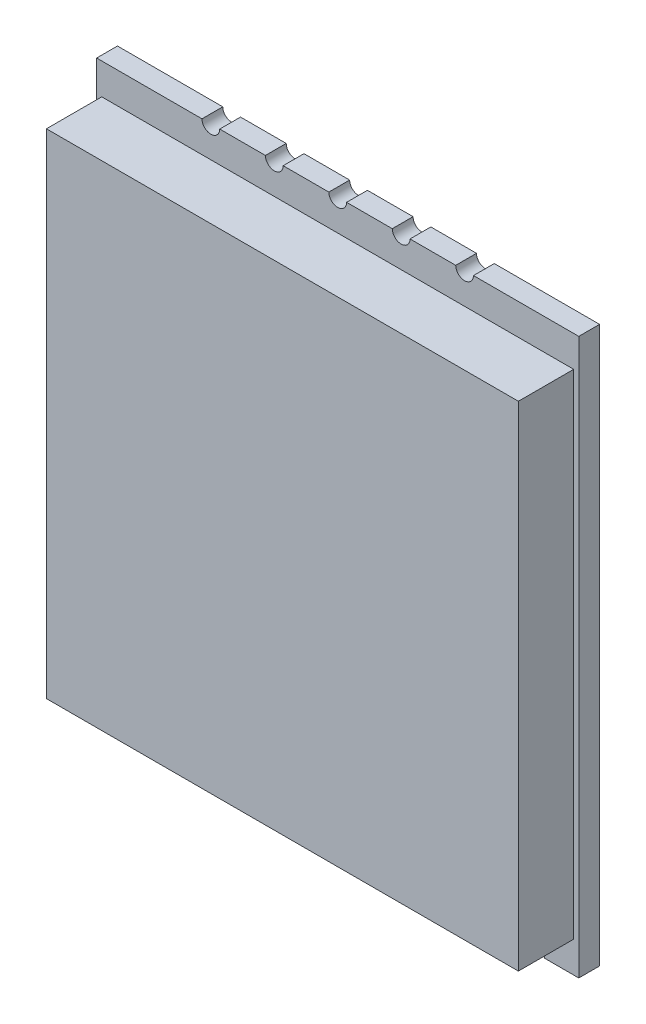
ISO-10303-21;
HEADER;
FILE_DESCRIPTION(('STEP AP214'),'2;1');
FILE_NAME('part.step','',(''),(''),'','','');
FILE_SCHEMA(('AUTOMOTIVE_DESIGN { 1 0 10303 214 1 1 1 1 }'));
ENDSEC;
DATA;
#1=APPLICATION_CONTEXT('core data for automotive mechanical design processes');
#2=APPLICATION_PROTOCOL_DEFINITION('international standard','automotive_design',2000,#1);
#3=PRODUCT_CONTEXT('',#1,'mechanical');
#4=PRODUCT('Part','Part','',(#3));
#5=PRODUCT_RELATED_PRODUCT_CATEGORY('part','',(#4));
#6=PRODUCT_DEFINITION_FORMATION('','',#4);
#7=PRODUCT_DEFINITION_CONTEXT('part definition',#1,'design');
#8=PRODUCT_DEFINITION('design','',#6,#7);
#9=PRODUCT_DEFINITION_SHAPE('','',#8);
#10=(LENGTH_UNIT() NAMED_UNIT(*) SI_UNIT(.MILLI.,.METRE.));
#11=(NAMED_UNIT(*) PLANE_ANGLE_UNIT() SI_UNIT($,.RADIAN.));
#12=(NAMED_UNIT(*) SI_UNIT($,.STERADIAN.) SOLID_ANGLE_UNIT());
#13=UNCERTAINTY_MEASURE_WITH_UNIT(LENGTH_MEASURE(1.E-05),#10,'distance_accuracy_value','');
#14=(GEOMETRIC_REPRESENTATION_CONTEXT(3) GLOBAL_UNCERTAINTY_ASSIGNED_CONTEXT((#13)) GLOBAL_UNIT_ASSIGNED_CONTEXT((#10,
#11,#12)) REPRESENTATION_CONTEXT('',''));
#15=CARTESIAN_POINT('',(0.,0.,0.));
#16=DIRECTION('',(0.,0.,1.));
#17=DIRECTION('',(1.,0.,0.));
#18=AXIS2_PLACEMENT_3D('',#15,#16,#17);
#19=CARTESIAN_POINT('',(0.,0.,0.82));
#20=DIRECTION('',(0.,1.,0.));
#21=DIRECTION('',(0.,0.,1.));
#22=AXIS2_PLACEMENT_3D('',#19,#20,#21);
#23=PLANE('',#22);
#24=DIRECTION('',(1.,0.,0.));
#25=VECTOR('',#24,1.);
#26=CARTESIAN_POINT('',(0.,0.,0.));
#27=LINE('',#26,#25);
#28=CARTESIAN_POINT('',(15.05,0.,0.));
#29=VERTEX_POINT('',#28);
#30=CARTESIAN_POINT('',(16.95,0.,0.));
#31=VERTEX_POINT('',#30);
#32=EDGE_CURVE('E260',#29,#31,#27,.T.);
#33=ORIENTED_EDGE('',*,*,#32,.T.);
#34=DIRECTION('',(0.,0.,1.));
#35=VECTOR('',#34,1.);
#36=CARTESIAN_POINT('',(16.95,0.,0.));
#37=LINE('',#36,#35);
#38=CARTESIAN_POINT('',(16.95,0.,0.82));
#39=VERTEX_POINT('',#38);
#40=EDGE_CURVE('E55',#31,#39,#37,.T.);
#41=ORIENTED_EDGE('',*,*,#40,.T.);
#42=DIRECTION('',(1.,0.,0.));
#43=VECTOR('',#42,1.);
#44=CARTESIAN_POINT('',(0.,0.,0.82));
#45=LINE('',#44,#43);
#46=CARTESIAN_POINT('',(15.05,0.,0.82));
#47=VERTEX_POINT('',#46);
#48=EDGE_CURVE('E508',#47,#39,#45,.T.);
#49=ORIENTED_EDGE('',*,*,#48,.F.);
#50=DIRECTION('',(0.,0.,1.));
#51=VECTOR('',#50,1.);
#52=CARTESIAN_POINT('',(15.05,0.,0.));
#53=LINE('',#52,#51);
#54=EDGE_CURVE('E304',#47,#29,#53,.F.);
#55=ORIENTED_EDGE('',*,*,#54,.T.);
#56=EDGE_LOOP('',(#33,#41,#49,#55));
#57=FACE_BOUND('',#56,.T.);
#58=ADVANCED_FACE('F39',(#57),#23,.F.);
#59=CARTESIAN_POINT('',(12.45,0.,0.));
#60=VERTEX_POINT('',#59);
#61=CARTESIAN_POINT('',(14.35,0.,0.));
#62=VERTEX_POINT('',#61);
#63=EDGE_CURVE('E264',#60,#62,#27,.T.);
#64=ORIENTED_EDGE('',*,*,#63,.T.);
#65=DIRECTION('',(0.,0.,1.));
#66=VECTOR('',#65,1.);
#67=CARTESIAN_POINT('',(14.35,0.,0.));
#68=LINE('',#67,#66);
#69=CARTESIAN_POINT('',(14.35,0.,0.82));
#70=VERTEX_POINT('',#69);
#71=EDGE_CURVE('E63',#62,#70,#68,.T.);
#72=ORIENTED_EDGE('',*,*,#71,.T.);
#73=CARTESIAN_POINT('',(12.45,0.,0.82));
#74=VERTEX_POINT('',#73);
#75=EDGE_CURVE('E509',#74,#70,#45,.T.);
#76=ORIENTED_EDGE('',*,*,#75,.F.);
#77=DIRECTION('',(0.,0.,1.));
#78=VECTOR('',#77,1.);
#79=CARTESIAN_POINT('',(12.45,0.,0.));
#80=LINE('',#79,#78);
#81=EDGE_CURVE('E299',#74,#60,#80,.F.);
#82=ORIENTED_EDGE('',*,*,#81,.T.);
#83=EDGE_LOOP('',(#64,#72,#76,#82));
#84=FACE_BOUND('',#83,.T.);
#85=ADVANCED_FACE('F296',(#84),#23,.F.);
#86=CARTESIAN_POINT('',(9.85,0.,0.));
#87=VERTEX_POINT('',#86);
#88=CARTESIAN_POINT('',(11.75,0.,0.));
#89=VERTEX_POINT('',#88);
#90=EDGE_CURVE('E282',#87,#89,#27,.T.);
#91=ORIENTED_EDGE('',*,*,#90,.T.);
#92=DIRECTION('',(0.,0.,1.));
#93=VECTOR('',#92,1.);
#94=CARTESIAN_POINT('',(11.75,0.,0.));
#95=LINE('',#94,#93);
#96=CARTESIAN_POINT('',(11.75,0.,0.82));
#97=VERTEX_POINT('',#96);
#98=EDGE_CURVE('E316',#89,#97,#95,.T.);
#99=ORIENTED_EDGE('',*,*,#98,.T.);
#100=CARTESIAN_POINT('',(9.85,0.,0.82));
#101=VERTEX_POINT('',#100);
#102=EDGE_CURVE('E512',#101,#97,#45,.T.);
#103=ORIENTED_EDGE('',*,*,#102,.F.);
#104=DIRECTION('',(0.,0.,1.));
#105=VECTOR('',#104,1.);
#106=CARTESIAN_POINT('',(9.85,0.,0.));
#107=LINE('',#106,#105);
#108=EDGE_CURVE('E322',#101,#87,#107,.F.);
#109=ORIENTED_EDGE('',*,*,#108,.T.);
#110=EDGE_LOOP('',(#91,#99,#103,#109));
#111=FACE_BOUND('',#110,.T.);
#112=ADVANCED_FACE('F529',(#111),#23,.F.);
#113=CARTESIAN_POINT('',(7.25,0.,0.));
#114=VERTEX_POINT('',#113);
#115=CARTESIAN_POINT('',(9.15,0.,0.));
#116=VERTEX_POINT('',#115);
#117=EDGE_CURVE('E276',#114,#116,#27,.T.);
#118=ORIENTED_EDGE('',*,*,#117,.T.);
#119=DIRECTION('',(0.,0.,1.));
#120=VECTOR('',#119,1.);
#121=CARTESIAN_POINT('',(9.15,0.,0.));
#122=LINE('',#121,#120);
#123=CARTESIAN_POINT('',(9.15,0.,0.82));
#124=VERTEX_POINT('',#123);
#125=EDGE_CURVE('E325',#116,#124,#122,.T.);
#126=ORIENTED_EDGE('',*,*,#125,.T.);
#127=CARTESIAN_POINT('',(7.25,0.,0.82));
#128=VERTEX_POINT('',#127);
#129=EDGE_CURVE('E515',#128,#124,#45,.T.);
#130=ORIENTED_EDGE('',*,*,#129,.F.);
#131=DIRECTION('',(0.,0.,1.));
#132=VECTOR('',#131,1.);
#133=CARTESIAN_POINT('',(7.25,0.,0.));
#134=LINE('',#133,#132);
#135=EDGE_CURVE('E331',#128,#114,#134,.F.);
#136=ORIENTED_EDGE('',*,*,#135,.T.);
#137=EDGE_LOOP('',(#118,#126,#130,#136));
#138=FACE_BOUND('',#137,.T.);
#139=ADVANCED_FACE('F561',(#138),#23,.F.);
#140=CARTESIAN_POINT('',(4.65,0.,0.));
#141=VERTEX_POINT('',#140);
#142=CARTESIAN_POINT('',(6.55,0.,0.));
#143=VERTEX_POINT('',#142);
#144=EDGE_CURVE('E270',#141,#143,#27,.T.);
#145=ORIENTED_EDGE('',*,*,#144,.T.);
#146=DIRECTION('',(0.,0.,1.));
#147=VECTOR('',#146,1.);
#148=CARTESIAN_POINT('',(6.55,0.,0.));
#149=LINE('',#148,#147);
#150=CARTESIAN_POINT('',(6.55,0.,0.82));
#151=VERTEX_POINT('',#150);
#152=EDGE_CURVE('E334',#143,#151,#149,.T.);
#153=ORIENTED_EDGE('',*,*,#152,.T.);
#154=CARTESIAN_POINT('',(4.65,0.,0.82));
#155=VERTEX_POINT('',#154);
#156=EDGE_CURVE('E434',#155,#151,#45,.T.);
#157=ORIENTED_EDGE('',*,*,#156,.F.);
#158=DIRECTION('',(0.,0.,1.));
#159=VECTOR('',#158,1.);
#160=CARTESIAN_POINT('',(4.65,0.,0.));
#161=LINE('',#160,#159);
#162=EDGE_CURVE('E340',#155,#141,#161,.F.);
#163=ORIENTED_EDGE('',*,*,#162,.T.);
#164=EDGE_LOOP('',(#145,#153,#157,#163));
#165=FACE_BOUND('',#164,.T.);
#166=ADVANCED_FACE('F524',(#165),#23,.F.);
#167=CARTESIAN_POINT('',(0.,0.,0.));
#168=VERTEX_POINT('',#167);
#169=CARTESIAN_POINT('',(3.95,0.,0.));
#170=VERTEX_POINT('',#169);
#171=EDGE_CURVE('E263',#168,#170,#27,.T.);
#172=ORIENTED_EDGE('',*,*,#171,.T.);
#173=DIRECTION('',(0.,0.,1.));
#174=VECTOR('',#173,1.);
#175=CARTESIAN_POINT('',(3.95,0.,0.));
#176=LINE('',#175,#174);
#177=CARTESIAN_POINT('',(3.95,0.,0.82));
#178=VERTEX_POINT('',#177);
#179=EDGE_CURVE('E343',#170,#178,#176,.T.);
#180=ORIENTED_EDGE('',*,*,#179,.T.);
#181=CARTESIAN_POINT('',(0.,0.,0.82));
#182=VERTEX_POINT('',#181);
#183=EDGE_CURVE('E430',#182,#178,#45,.T.);
#184=ORIENTED_EDGE('',*,*,#183,.F.);
#185=DIRECTION('',(0.,0.,-1.));
#186=VECTOR('',#185,1.);
#187=CARTESIAN_POINT('',(0.,0.,0.82));
#188=LINE('',#187,#186);
#189=EDGE_CURVE('E485',#182,#168,#188,.T.);
#190=ORIENTED_EDGE('',*,*,#189,.T.);
#191=EDGE_LOOP('',(#172,#180,#184,#190));
#192=FACE_BOUND('',#191,.T.);
#193=ADVANCED_FACE('F548',(#192),#23,.F.);
#194=CARTESIAN_POINT('',(0.,21.9,0.82));
#195=DIRECTION('',(0.,-1.,0.));
#196=DIRECTION('',(0.,0.,-1.));
#197=AXIS2_PLACEMENT_3D('',#194,#195,#196);
#198=PLANE('',#197);
#199=DIRECTION('',(-1.,0.,0.));
#200=VECTOR('',#199,1.);
#201=CARTESIAN_POINT('',(0.,21.9,0.));
#202=LINE('',#201,#200);
#203=CARTESIAN_POINT('',(19.,21.9,0.));
#204=VERTEX_POINT('',#203);
#205=CARTESIAN_POINT('',(14.85,21.9,0.));
#206=VERTEX_POINT('',#205);
#207=EDGE_CURVE('E429',#204,#206,#202,.T.);
#208=ORIENTED_EDGE('',*,*,#207,.T.);
#209=DIRECTION('',(0.,0.,1.));
#210=VECTOR('',#209,1.);
#211=CARTESIAN_POINT('',(14.85,21.9,0.));
#212=LINE('',#211,#210);
#213=CARTESIAN_POINT('',(14.85,21.9,0.82));
#214=VERTEX_POINT('',#213);
#215=EDGE_CURVE('E352',#206,#214,#212,.T.);
#216=ORIENTED_EDGE('',*,*,#215,.T.);
#217=DIRECTION('',(-1.,0.,0.));
#218=VECTOR('',#217,1.);
#219=CARTESIAN_POINT('',(0.,21.9,0.82));
#220=LINE('',#219,#218);
#221=CARTESIAN_POINT('',(19.,21.9,0.82));
#222=VERTEX_POINT('',#221);
#223=EDGE_CURVE('E437',#222,#214,#220,.T.);
#224=ORIENTED_EDGE('',*,*,#223,.F.);
#225=DIRECTION('',(0.,0.,-1.));
#226=VECTOR('',#225,1.);
#227=CARTESIAN_POINT('',(19.,21.9,0.82));
#228=LINE('',#227,#226);
#229=EDGE_CURVE('E446',#222,#204,#228,.T.);
#230=ORIENTED_EDGE('',*,*,#229,.T.);
#231=EDGE_LOOP('',(#208,#216,#224,#230));
#232=FACE_BOUND('',#231,.T.);
#233=ADVANCED_FACE('F503',(#232),#198,.F.);
#234=CARTESIAN_POINT('',(14.15,21.9,0.82));
#235=VERTEX_POINT('',#234);
#236=CARTESIAN_POINT('',(12.35,21.9,0.82));
#237=VERTEX_POINT('',#236);
#238=EDGE_CURVE('E441',#235,#237,#220,.T.);
#239=ORIENTED_EDGE('',*,*,#238,.F.);
#240=DIRECTION('',(0.,0.,1.));
#241=VECTOR('',#240,1.);
#242=CARTESIAN_POINT('',(14.15,21.9,0.));
#243=LINE('',#242,#241);
#244=CARTESIAN_POINT('',(14.15,21.9,0.));
#245=VERTEX_POINT('',#244);
#246=EDGE_CURVE('E348',#235,#245,#243,.F.);
#247=ORIENTED_EDGE('',*,*,#246,.T.);
#248=CARTESIAN_POINT('',(12.35,21.9,0.));
#249=VERTEX_POINT('',#248);
#250=EDGE_CURVE('E473',#245,#249,#202,.T.);
#251=ORIENTED_EDGE('',*,*,#250,.T.);
#252=DIRECTION('',(0.,0.,1.));
#253=VECTOR('',#252,1.);
#254=CARTESIAN_POINT('',(12.35,21.9,0.));
#255=LINE('',#254,#253);
#256=EDGE_CURVE('E362',#249,#237,#255,.T.);
#257=ORIENTED_EDGE('',*,*,#256,.T.);
#258=EDGE_LOOP('',(#239,#247,#251,#257));
#259=FACE_BOUND('',#258,.T.);
#260=ADVANCED_FACE('F499',(#259),#198,.F.);
#261=CARTESIAN_POINT('',(11.65,21.9,0.82));
#262=VERTEX_POINT('',#261);
#263=CARTESIAN_POINT('',(9.85,21.9,0.82));
#264=VERTEX_POINT('',#263);
#265=EDGE_CURVE('E449',#262,#264,#220,.T.);
#266=ORIENTED_EDGE('',*,*,#265,.F.);
#267=DIRECTION('',(0.,0.,1.));
#268=VECTOR('',#267,1.);
#269=CARTESIAN_POINT('',(11.65,21.9,0.));
#270=LINE('',#269,#268);
#271=CARTESIAN_POINT('',(11.65,21.9,0.));
#272=VERTEX_POINT('',#271);
#273=EDGE_CURVE('E359',#262,#272,#270,.F.);
#274=ORIENTED_EDGE('',*,*,#273,.T.);
#275=CARTESIAN_POINT('',(9.85,21.9,0.));
#276=VERTEX_POINT('',#275);
#277=EDGE_CURVE('E471',#272,#276,#202,.T.);
#278=ORIENTED_EDGE('',*,*,#277,.T.);
#279=DIRECTION('',(0.,0.,1.));
#280=VECTOR('',#279,1.);
#281=CARTESIAN_POINT('',(9.85,21.9,0.));
#282=LINE('',#281,#280);
#283=EDGE_CURVE('E371',#276,#264,#282,.T.);
#284=ORIENTED_EDGE('',*,*,#283,.T.);
#285=EDGE_LOOP('',(#266,#274,#278,#284));
#286=FACE_BOUND('',#285,.T.);
#287=ADVANCED_FACE('F469',(#286),#198,.F.);
#288=CARTESIAN_POINT('',(9.15,21.9,0.82));
#289=VERTEX_POINT('',#288);
#290=CARTESIAN_POINT('',(7.35,21.9,0.82));
#291=VERTEX_POINT('',#290);
#292=EDGE_CURVE('E454',#289,#291,#220,.T.);
#293=ORIENTED_EDGE('',*,*,#292,.F.);
#294=DIRECTION('',(0.,0.,1.));
#295=VECTOR('',#294,1.);
#296=CARTESIAN_POINT('',(9.15,21.9,0.));
#297=LINE('',#296,#295);
#298=CARTESIAN_POINT('',(9.15,21.9,0.));
#299=VERTEX_POINT('',#298);
#300=EDGE_CURVE('E368',#289,#299,#297,.F.);
#301=ORIENTED_EDGE('',*,*,#300,.T.);
#302=CARTESIAN_POINT('',(7.35,21.9,0.));
#303=VERTEX_POINT('',#302);
#304=EDGE_CURVE('E474',#299,#303,#202,.T.);
#305=ORIENTED_EDGE('',*,*,#304,.T.);
#306=DIRECTION('',(0.,0.,1.));
#307=VECTOR('',#306,1.);
#308=CARTESIAN_POINT('',(7.35,21.9,0.));
#309=LINE('',#308,#307);
#310=EDGE_CURVE('E380',#303,#291,#309,.T.);
#311=ORIENTED_EDGE('',*,*,#310,.T.);
#312=EDGE_LOOP('',(#293,#301,#305,#311));
#313=FACE_BOUND('',#312,.T.);
#314=ADVANCED_FACE('F663',(#313),#198,.F.);
#315=CARTESIAN_POINT('',(6.65,21.9,0.82));
#316=VERTEX_POINT('',#315);
#317=CARTESIAN_POINT('',(4.85,21.9,0.82));
#318=VERTEX_POINT('',#317);
#319=EDGE_CURVE('E450',#316,#318,#220,.T.);
#320=ORIENTED_EDGE('',*,*,#319,.F.);
#321=DIRECTION('',(0.,0.,1.));
#322=VECTOR('',#321,1.);
#323=CARTESIAN_POINT('',(6.65,21.9,0.));
#324=LINE('',#323,#322);
#325=CARTESIAN_POINT('',(6.65,21.9,0.));
#326=VERTEX_POINT('',#325);
#327=EDGE_CURVE('E377',#316,#326,#324,.F.);
#328=ORIENTED_EDGE('',*,*,#327,.T.);
#329=CARTESIAN_POINT('',(4.85,21.9,0.));
#330=VERTEX_POINT('',#329);
#331=EDGE_CURVE('E477',#326,#330,#202,.T.);
#332=ORIENTED_EDGE('',*,*,#331,.T.);
#333=DIRECTION('',(0.,0.,1.));
#334=VECTOR('',#333,1.);
#335=CARTESIAN_POINT('',(4.85,21.9,0.));
#336=LINE('',#335,#334);
#337=EDGE_CURVE('E389',#330,#318,#336,.T.);
#338=ORIENTED_EDGE('',*,*,#337,.T.);
#339=EDGE_LOOP('',(#320,#328,#332,#338));
#340=FACE_BOUND('',#339,.T.);
#341=ADVANCED_FACE('F657',(#340),#198,.F.);
#342=CARTESIAN_POINT('',(0.,0.,0.82));
#343=DIRECTION('',(0.,0.,-1.));
#344=DIRECTION('',(-1.,0.,0.));
#345=AXIS2_PLACEMENT_3D('',#342,#343,#344);
#346=PLANE('',#345);
#347=ORIENTED_EDGE('',*,*,#48,.T.);
#348=CARTESIAN_POINT('',(17.3,0.,0.82));
#349=DIRECTION('',(0.,0.,1.));
#350=DIRECTION('',(1.,0.,0.));
#351=AXIS2_PLACEMENT_3D('',#348,#349,#350);
#352=CIRCLE('',#351,0.350000000000001);
#353=CARTESIAN_POINT('',(17.65,0.,0.82));
#354=VERTEX_POINT('',#353);
#355=EDGE_CURVE('E246',#354,#39,#352,.T.);
#356=ORIENTED_EDGE('',*,*,#355,.F.);
#357=CARTESIAN_POINT('',(19.,0.,0.82));
#358=VERTEX_POINT('',#357);
#359=EDGE_CURVE('E254',#354,#358,#45,.T.);
#360=ORIENTED_EDGE('',*,*,#359,.T.);
#361=DIRECTION('',(0.,1.,0.));
#362=VECTOR('',#361,1.);
#363=CARTESIAN_POINT('',(19.,0.,0.82));
#364=LINE('',#363,#362);
#365=EDGE_CURVE('E433',#358,#222,#364,.T.);
#366=ORIENTED_EDGE('',*,*,#365,.T.);
#367=ORIENTED_EDGE('',*,*,#223,.T.);
#368=CARTESIAN_POINT('',(14.5,21.9,0.82));
#369=DIRECTION('',(0.,0.,1.));
#370=DIRECTION('',(1.,0.,0.));
#371=AXIS2_PLACEMENT_3D('',#368,#369,#370);
#372=CIRCLE('',#371,0.349999999999999);
#373=EDGE_CURVE('E345',#235,#214,#372,.T.);
#374=ORIENTED_EDGE('',*,*,#373,.F.);
#375=ORIENTED_EDGE('',*,*,#238,.T.);
#376=CARTESIAN_POINT('',(12.,21.9,0.82));
#377=DIRECTION('',(0.,0.,1.));
#378=DIRECTION('',(1.,0.,0.));
#379=AXIS2_PLACEMENT_3D('',#376,#377,#378);
#380=CIRCLE('',#379,0.349999999999999);
#381=EDGE_CURVE('E356',#262,#237,#380,.T.);
#382=ORIENTED_EDGE('',*,*,#381,.F.);
#383=ORIENTED_EDGE('',*,*,#265,.T.);
#384=CARTESIAN_POINT('',(9.5,21.9,0.82));
#385=DIRECTION('',(0.,0.,1.));
#386=DIRECTION('',(1.,0.,0.));
#387=AXIS2_PLACEMENT_3D('',#384,#385,#386);
#388=CIRCLE('',#387,0.349999999999999);
#389=EDGE_CURVE('E365',#289,#264,#388,.T.);
#390=ORIENTED_EDGE('',*,*,#389,.F.);
#391=ORIENTED_EDGE('',*,*,#292,.T.);
#392=CARTESIAN_POINT('',(7.,21.9,0.82));
#393=DIRECTION('',(0.,0.,1.));
#394=DIRECTION('',(1.,0.,0.));
#395=AXIS2_PLACEMENT_3D('',#392,#393,#394);
#396=CIRCLE('',#395,0.349999999999999);
#397=EDGE_CURVE('E374',#316,#291,#396,.T.);
#398=ORIENTED_EDGE('',*,*,#397,.F.);
#399=ORIENTED_EDGE('',*,*,#319,.T.);
#400=CARTESIAN_POINT('',(4.5,21.9,0.82));
#401=DIRECTION('',(0.,0.,1.));
#402=DIRECTION('',(1.,0.,0.));
#403=AXIS2_PLACEMENT_3D('',#400,#401,#402);
#404=CIRCLE('',#403,0.35);
#405=CARTESIAN_POINT('',(4.15,21.9,0.82));
#406=VERTEX_POINT('',#405);
#407=EDGE_CURVE('E383',#406,#318,#404,.T.);
#408=ORIENTED_EDGE('',*,*,#407,.F.);
#409=CARTESIAN_POINT('',(0.,21.9,0.82));
#410=VERTEX_POINT('',#409);
#411=EDGE_CURVE('E436',#406,#410,#220,.T.);
#412=ORIENTED_EDGE('',*,*,#411,.T.);
#413=DIRECTION('',(0.,-1.,0.));
#414=VECTOR('',#413,1.);
#415=CARTESIAN_POINT('',(0.,0.,0.82));
#416=LINE('',#415,#414);
#417=EDGE_CURVE('E426',#410,#182,#416,.T.);
#418=ORIENTED_EDGE('',*,*,#417,.T.);
#419=ORIENTED_EDGE('',*,*,#183,.T.);
#420=CARTESIAN_POINT('',(4.3,0.,0.82));
#421=DIRECTION('',(0.,0.,1.));
#422=DIRECTION('',(1.,0.,0.));
#423=AXIS2_PLACEMENT_3D('',#420,#421,#422);
#424=CIRCLE('',#423,0.349999999999999);
#425=EDGE_CURVE('E336',#155,#178,#424,.T.);
#426=ORIENTED_EDGE('',*,*,#425,.F.);
#427=ORIENTED_EDGE('',*,*,#156,.T.);
#428=CARTESIAN_POINT('',(6.9,0.,0.82));
#429=DIRECTION('',(0.,0.,1.));
#430=DIRECTION('',(1.,0.,0.));
#431=AXIS2_PLACEMENT_3D('',#428,#429,#430);
#432=CIRCLE('',#431,0.349999999999999);
#433=EDGE_CURVE('E327',#128,#151,#432,.T.);
#434=ORIENTED_EDGE('',*,*,#433,.F.);
#435=ORIENTED_EDGE('',*,*,#129,.T.);
#436=CARTESIAN_POINT('',(9.5,0.,0.82));
#437=DIRECTION('',(0.,0.,1.));
#438=DIRECTION('',(1.,0.,0.));
#439=AXIS2_PLACEMENT_3D('',#436,#437,#438);
#440=CIRCLE('',#439,0.349999999999999);
#441=EDGE_CURVE('E318',#101,#124,#440,.T.);
#442=ORIENTED_EDGE('',*,*,#441,.F.);
#443=ORIENTED_EDGE('',*,*,#102,.T.);
#444=CARTESIAN_POINT('',(12.1,0.,0.82));
#445=DIRECTION('',(0.,0.,1.));
#446=DIRECTION('',(1.,0.,0.));
#447=AXIS2_PLACEMENT_3D('',#444,#445,#446);
#448=CIRCLE('',#447,0.349999999999999);
#449=EDGE_CURVE('E312',#74,#97,#448,.T.);
#450=ORIENTED_EDGE('',*,*,#449,.F.);
#451=ORIENTED_EDGE('',*,*,#75,.T.);
#452=CARTESIAN_POINT('',(14.7,0.,0.82));
#453=DIRECTION('',(0.,0.,1.));
#454=DIRECTION('',(1.,0.,0.));
#455=AXIS2_PLACEMENT_3D('',#452,#453,#454);
#456=CIRCLE('',#455,0.350000000000001);
#457=EDGE_CURVE('E305',#47,#70,#456,.T.);
#458=ORIENTED_EDGE('',*,*,#457,.F.);
#459=EDGE_LOOP('',(#347,#356,#360,#366,#367,#374,#375,#382,#383,#390,#391,#398,#399,#408,#412,
#418,#419,#426,#427,#434,#435,#442,#443,#450,#451,#458));
#460=FACE_BOUND('',#459,.T.);
#461=DIRECTION('',(0.,-1.,0.));
#462=VECTOR('',#461,1.);
#463=CARTESIAN_POINT('',(0.199999999999999,1.225,0.82));
#464=LINE('',#463,#462);
#465=CARTESIAN_POINT('',(0.199999999999999,20.675,0.82));
#466=VERTEX_POINT('',#465);
#467=CARTESIAN_POINT('',(0.199999999999999,1.225,0.82));
#468=VERTEX_POINT('',#467);
#469=EDGE_CURVE('E392',#466,#468,#464,.T.);
#470=ORIENTED_EDGE('',*,*,#469,.F.);
#471=DIRECTION('',(-1.,0.,0.));
#472=VECTOR('',#471,1.);
#473=CARTESIAN_POINT('',(0.199999999999999,20.675,0.82));
#474=LINE('',#473,#472);
#475=CARTESIAN_POINT('',(18.8,20.675,0.82));
#476=VERTEX_POINT('',#475);
#477=EDGE_CURVE('E397',#476,#466,#474,.T.);
#478=ORIENTED_EDGE('',*,*,#477,.F.);
#479=DIRECTION('',(0.,1.,0.));
#480=VECTOR('',#479,1.);
#481=CARTESIAN_POINT('',(18.8,1.225,0.82));
#482=LINE('',#481,#480);
#483=CARTESIAN_POINT('',(18.8,1.225,0.82));
#484=VERTEX_POINT('',#483);
#485=EDGE_CURVE('E410',#484,#476,#482,.T.);
#486=ORIENTED_EDGE('',*,*,#485,.F.);
#487=DIRECTION('',(1.,0.,0.));
#488=VECTOR('',#487,1.);
#489=CARTESIAN_POINT('',(0.199999999999999,1.225,0.82));
#490=LINE('',#489,#488);
#491=EDGE_CURVE('E407',#468,#484,#490,.T.);
#492=ORIENTED_EDGE('',*,*,#491,.F.);
#493=EDGE_LOOP('',(#470,#478,#486,#492));
#494=FACE_BOUND('',#493,.T.);
#495=ADVANCED_FACE('F462',(#460,#494),#346,.F.);
#496=CARTESIAN_POINT('',(0.,0.,0.82));
#497=DIRECTION('',(1.,0.,0.));
#498=DIRECTION('',(0.,0.,-1.));
#499=AXIS2_PLACEMENT_3D('',#496,#497,#498);
#500=PLANE('',#499);
#501=DIRECTION('',(0.,-1.,0.));
#502=VECTOR('',#501,1.);
#503=CARTESIAN_POINT('',(0.,0.,0.));
#504=LINE('',#503,#502);
#505=CARTESIAN_POINT('',(0.,21.9,0.));
#506=VERTEX_POINT('',#505);
#507=EDGE_CURVE('E261',#506,#168,#504,.T.);
#508=ORIENTED_EDGE('',*,*,#507,.T.);
#509=ORIENTED_EDGE('',*,*,#189,.F.);
#510=ORIENTED_EDGE('',*,*,#417,.F.);
#511=DIRECTION('',(0.,0.,-1.));
#512=VECTOR('',#511,1.);
#513=CARTESIAN_POINT('',(0.,21.9,0.82));
#514=LINE('',#513,#512);
#515=EDGE_CURVE('E440',#410,#506,#514,.T.);
#516=ORIENTED_EDGE('',*,*,#515,.T.);
#517=EDGE_LOOP('',(#508,#509,#510,#516));
#518=FACE_BOUND('',#517,.T.);
#519=ADVANCED_FACE('F41',(#518),#500,.F.);
#520=ORIENTED_EDGE('',*,*,#359,.F.);
#521=DIRECTION('',(0.,0.,1.));
#522=VECTOR('',#521,1.);
#523=CARTESIAN_POINT('',(17.65,0.,0.));
#524=LINE('',#523,#522);
#525=CARTESIAN_POINT('',(17.65,0.,0.));
#526=VERTEX_POINT('',#525);
#527=EDGE_CURVE('E240',#354,#526,#524,.F.);
#528=ORIENTED_EDGE('',*,*,#527,.T.);
#529=CARTESIAN_POINT('',(19.,0.,0.));
#530=VERTEX_POINT('',#529);
#531=EDGE_CURVE('E252',#526,#530,#27,.T.);
#532=ORIENTED_EDGE('',*,*,#531,.T.);
#533=DIRECTION('',(0.,0.,-1.));
#534=VECTOR('',#533,1.);
#535=CARTESIAN_POINT('',(19.,0.,0.82));
#536=LINE('',#535,#534);
#537=EDGE_CURVE('E483',#358,#530,#536,.T.);
#538=ORIENTED_EDGE('',*,*,#537,.F.);
#539=EDGE_LOOP('',(#520,#528,#532,#538));
#540=FACE_BOUND('',#539,.T.);
#541=ADVANCED_FACE('F250',(#540),#23,.F.);
#542=CARTESIAN_POINT('',(19.,0.,0.82));
#543=DIRECTION('',(-1.,0.,0.));
#544=DIRECTION('',(0.,0.,1.));
#545=AXIS2_PLACEMENT_3D('',#542,#543,#544);
#546=PLANE('',#545);
#547=DIRECTION('',(0.,1.,0.));
#548=VECTOR('',#547,1.);
#549=CARTESIAN_POINT('',(19.,0.,0.));
#550=LINE('',#549,#548);
#551=EDGE_CURVE('E259',#530,#204,#550,.T.);
#552=ORIENTED_EDGE('',*,*,#551,.T.);
#553=ORIENTED_EDGE('',*,*,#229,.F.);
#554=ORIENTED_EDGE('',*,*,#365,.F.);
#555=ORIENTED_EDGE('',*,*,#537,.T.);
#556=EDGE_LOOP('',(#552,#553,#554,#555));
#557=FACE_BOUND('',#556,.T.);
#558=ADVANCED_FACE('F507',(#557),#546,.F.);
#559=ORIENTED_EDGE('',*,*,#411,.F.);
#560=DIRECTION('',(0.,0.,1.));
#561=VECTOR('',#560,1.);
#562=CARTESIAN_POINT('',(4.15,21.9,0.));
#563=LINE('',#562,#561);
#564=CARTESIAN_POINT('',(4.15,21.9,0.));
#565=VERTEX_POINT('',#564);
#566=EDGE_CURVE('E386',#406,#565,#563,.F.);
#567=ORIENTED_EDGE('',*,*,#566,.T.);
#568=EDGE_CURVE('E274',#565,#506,#202,.T.);
#569=ORIENTED_EDGE('',*,*,#568,.T.);
#570=ORIENTED_EDGE('',*,*,#515,.F.);
#571=EDGE_LOOP('',(#559,#567,#569,#570));
#572=FACE_BOUND('',#571,.T.);
#573=ADVANCED_FACE('F553',(#572),#198,.F.);
#574=CARTESIAN_POINT('',(0.,0.,0.));
#575=DIRECTION('',(0.,0.,-1.));
#576=DIRECTION('',(-1.,0.,0.));
#577=AXIS2_PLACEMENT_3D('',#574,#575,#576);
#578=PLANE('',#577);
#579=CARTESIAN_POINT('',(17.3,0.,0.));
#580=DIRECTION('',(0.,0.,1.));
#581=DIRECTION('',(1.,0.,0.));
#582=AXIS2_PLACEMENT_3D('',#579,#580,#581);
#583=CIRCLE('',#582,0.350000000000001);
#584=EDGE_CURVE('E237',#526,#31,#583,.T.);
#585=ORIENTED_EDGE('',*,*,#584,.T.);
#586=ORIENTED_EDGE('',*,*,#32,.F.);
#587=CARTESIAN_POINT('',(14.7,0.,0.));
#588=DIRECTION('',(0.,0.,1.));
#589=DIRECTION('',(1.,0.,0.));
#590=AXIS2_PLACEMENT_3D('',#587,#588,#589);
#591=CIRCLE('',#590,0.350000000000001);
#592=EDGE_CURVE('E302',#29,#62,#591,.T.);
#593=ORIENTED_EDGE('',*,*,#592,.T.);
#594=ORIENTED_EDGE('',*,*,#63,.F.);
#595=CARTESIAN_POINT('',(12.1,0.,0.));
#596=DIRECTION('',(0.,0.,1.));
#597=DIRECTION('',(1.,0.,0.));
#598=AXIS2_PLACEMENT_3D('',#595,#596,#597);
#599=CIRCLE('',#598,0.349999999999999);
#600=EDGE_CURVE('E301',#60,#89,#599,.T.);
#601=ORIENTED_EDGE('',*,*,#600,.T.);
#602=ORIENTED_EDGE('',*,*,#90,.F.);
#603=CARTESIAN_POINT('',(9.5,0.,0.));
#604=DIRECTION('',(0.,0.,1.));
#605=DIRECTION('',(1.,0.,0.));
#606=AXIS2_PLACEMENT_3D('',#603,#604,#605);
#607=CIRCLE('',#606,0.349999999999999);
#608=EDGE_CURVE('E319',#87,#116,#607,.T.);
#609=ORIENTED_EDGE('',*,*,#608,.T.);
#610=ORIENTED_EDGE('',*,*,#117,.F.);
#611=CARTESIAN_POINT('',(6.9,0.,0.));
#612=DIRECTION('',(0.,0.,1.));
#613=DIRECTION('',(1.,0.,0.));
#614=AXIS2_PLACEMENT_3D('',#611,#612,#613);
#615=CIRCLE('',#614,0.349999999999999);
#616=EDGE_CURVE('E328',#114,#143,#615,.T.);
#617=ORIENTED_EDGE('',*,*,#616,.T.);
#618=ORIENTED_EDGE('',*,*,#144,.F.);
#619=CARTESIAN_POINT('',(4.3,0.,0.));
#620=DIRECTION('',(0.,0.,1.));
#621=DIRECTION('',(1.,0.,0.));
#622=AXIS2_PLACEMENT_3D('',#619,#620,#621);
#623=CIRCLE('',#622,0.349999999999999);
#624=EDGE_CURVE('E337',#141,#170,#623,.T.);
#625=ORIENTED_EDGE('',*,*,#624,.T.);
#626=ORIENTED_EDGE('',*,*,#171,.F.);
#627=ORIENTED_EDGE('',*,*,#507,.F.);
#628=ORIENTED_EDGE('',*,*,#568,.F.);
#629=CARTESIAN_POINT('',(4.5,21.9,0.));
#630=DIRECTION('',(0.,0.,-1.));
#631=DIRECTION('',(-1.,0.,0.));
#632=AXIS2_PLACEMENT_3D('',#629,#630,#631);
#633=CIRCLE('',#632,0.35);
#634=EDGE_CURVE('E487',#330,#565,#633,.T.);
#635=ORIENTED_EDGE('',*,*,#634,.F.);
#636=ORIENTED_EDGE('',*,*,#331,.F.);
#637=CARTESIAN_POINT('',(7.,21.9,0.));
#638=DIRECTION('',(0.,0.,-1.));
#639=DIRECTION('',(-1.,0.,0.));
#640=AXIS2_PLACEMENT_3D('',#637,#638,#639);
#641=CIRCLE('',#640,0.349999999999999);
#642=EDGE_CURVE('E489',#303,#326,#641,.T.);
#643=ORIENTED_EDGE('',*,*,#642,.F.);
#644=ORIENTED_EDGE('',*,*,#304,.F.);
#645=CARTESIAN_POINT('',(9.5,21.9,0.));
#646=DIRECTION('',(0.,0.,-1.));
#647=DIRECTION('',(-1.,0.,0.));
#648=AXIS2_PLACEMENT_3D('',#645,#646,#647);
#649=CIRCLE('',#648,0.349999999999999);
#650=EDGE_CURVE('E491',#276,#299,#649,.T.);
#651=ORIENTED_EDGE('',*,*,#650,.F.);
#652=ORIENTED_EDGE('',*,*,#277,.F.);
#653=CARTESIAN_POINT('',(12.,21.9,0.));
#654=DIRECTION('',(0.,0.,-1.));
#655=DIRECTION('',(-1.,0.,0.));
#656=AXIS2_PLACEMENT_3D('',#653,#654,#655);
#657=CIRCLE('',#656,0.349999999999999);
#658=EDGE_CURVE('E48',#249,#272,#657,.T.);
#659=ORIENTED_EDGE('',*,*,#658,.F.);
#660=ORIENTED_EDGE('',*,*,#250,.F.);
#661=CARTESIAN_POINT('',(14.5,21.9,0.));
#662=DIRECTION('',(0.,0.,-1.));
#663=DIRECTION('',(-1.,0.,0.));
#664=AXIS2_PLACEMENT_3D('',#661,#662,#663);
#665=CIRCLE('',#664,0.349999999999999);
#666=EDGE_CURVE('E11',#206,#245,#665,.T.);
#667=ORIENTED_EDGE('',*,*,#666,.F.);
#668=ORIENTED_EDGE('',*,*,#207,.F.);
#669=ORIENTED_EDGE('',*,*,#551,.F.);
#670=ORIENTED_EDGE('',*,*,#531,.F.);
#671=EDGE_LOOP('',(#585,#586,#593,#594,#601,#602,#609,#610,#617,#618,#625,#626,#627,#628,#635,
#636,#643,#644,#651,#652,#659,#660,#667,#668,#669,#670));
#672=FACE_BOUND('',#671,.T.);
#673=ADVANCED_FACE('F257',(#672),#578,.T.);
#674=CARTESIAN_POINT('',(0.199999999999999,1.225,3.));
#675=DIRECTION('',(1.,0.,0.));
#676=DIRECTION('',(0.,0.,-1.));
#677=AXIS2_PLACEMENT_3D('',#674,#675,#676);
#678=PLANE('',#677);
#679=ORIENTED_EDGE('',*,*,#469,.T.);
#680=DIRECTION('',(0.,0.,-1.));
#681=VECTOR('',#680,1.);
#682=CARTESIAN_POINT('',(0.199999999999999,1.225,3.));
#683=LINE('',#682,#681);
#684=CARTESIAN_POINT('',(0.199999999999999,1.225,3.));
#685=VERTEX_POINT('',#684);
#686=EDGE_CURVE('E266',#685,#468,#683,.T.);
#687=ORIENTED_EDGE('',*,*,#686,.F.);
#688=DIRECTION('',(0.,-1.,0.));
#689=VECTOR('',#688,1.);
#690=CARTESIAN_POINT('',(0.199999999999999,1.225,3.));
#691=LINE('',#690,#689);
#692=CARTESIAN_POINT('',(0.199999999999999,20.675,3.));
#693=VERTEX_POINT('',#692);
#694=EDGE_CURVE('E393',#693,#685,#691,.T.);
#695=ORIENTED_EDGE('',*,*,#694,.F.);
#696=DIRECTION('',(0.,0.,-1.));
#697=VECTOR('',#696,1.);
#698=CARTESIAN_POINT('',(0.199999999999999,20.675,3.));
#699=LINE('',#698,#697);
#700=EDGE_CURVE('E404',#693,#466,#699,.T.);
#701=ORIENTED_EDGE('',*,*,#700,.T.);
#702=EDGE_LOOP('',(#679,#687,#695,#701));
#703=FACE_BOUND('',#702,.T.);
#704=ADVANCED_FACE('F623',(#703),#678,.F.);
#705=CARTESIAN_POINT('',(0.199999999999999,1.225,3.));
#706=DIRECTION('',(0.,1.,0.));
#707=DIRECTION('',(0.,0.,1.));
#708=AXIS2_PLACEMENT_3D('',#705,#706,#707);
#709=PLANE('',#708);
#710=ORIENTED_EDGE('',*,*,#491,.T.);
#711=DIRECTION('',(0.,0.,-1.));
#712=VECTOR('',#711,1.);
#713=CARTESIAN_POINT('',(18.8,1.225,3.));
#714=LINE('',#713,#712);
#715=CARTESIAN_POINT('',(18.8,1.225,3.));
#716=VERTEX_POINT('',#715);
#717=EDGE_CURVE('E421',#716,#484,#714,.T.);
#718=ORIENTED_EDGE('',*,*,#717,.F.);
#719=DIRECTION('',(1.,0.,0.));
#720=VECTOR('',#719,1.);
#721=CARTESIAN_POINT('',(0.199999999999999,1.225,3.));
#722=LINE('',#721,#720);
#723=EDGE_CURVE('E396',#685,#716,#722,.T.);
#724=ORIENTED_EDGE('',*,*,#723,.F.);
#725=ORIENTED_EDGE('',*,*,#686,.T.);
#726=EDGE_LOOP('',(#710,#718,#724,#725));
#727=FACE_BOUND('',#726,.T.);
#728=ADVANCED_FACE('F613',(#727),#709,.F.);
#729=CARTESIAN_POINT('',(18.8,1.225,3.));
#730=DIRECTION('',(-1.,0.,0.));
#731=DIRECTION('',(0.,0.,1.));
#732=AXIS2_PLACEMENT_3D('',#729,#730,#731);
#733=PLANE('',#732);
#734=ORIENTED_EDGE('',*,*,#485,.T.);
#735=DIRECTION('',(0.,0.,-1.));
#736=VECTOR('',#735,1.);
#737=CARTESIAN_POINT('',(18.8,20.675,3.));
#738=LINE('',#737,#736);
#739=CARTESIAN_POINT('',(18.8,20.675,3.));
#740=VERTEX_POINT('',#739);
#741=EDGE_CURVE('E418',#740,#476,#738,.T.);
#742=ORIENTED_EDGE('',*,*,#741,.F.);
#743=DIRECTION('',(0.,1.,0.));
#744=VECTOR('',#743,1.);
#745=CARTESIAN_POINT('',(18.8,1.225,3.));
#746=LINE('',#745,#744);
#747=EDGE_CURVE('E399',#716,#740,#746,.T.);
#748=ORIENTED_EDGE('',*,*,#747,.F.);
#749=ORIENTED_EDGE('',*,*,#717,.T.);
#750=EDGE_LOOP('',(#734,#742,#748,#749));
#751=FACE_BOUND('',#750,.T.);
#752=ADVANCED_FACE('F603',(#751),#733,.F.);
#753=CARTESIAN_POINT('',(0.199999999999999,20.675,3.));
#754=DIRECTION('',(0.,-1.,0.));
#755=DIRECTION('',(0.,0.,-1.));
#756=AXIS2_PLACEMENT_3D('',#753,#754,#755);
#757=PLANE('',#756);
#758=ORIENTED_EDGE('',*,*,#477,.T.);
#759=ORIENTED_EDGE('',*,*,#700,.F.);
#760=DIRECTION('',(-1.,0.,0.));
#761=VECTOR('',#760,1.);
#762=CARTESIAN_POINT('',(0.199999999999999,20.675,3.));
#763=LINE('',#762,#761);
#764=EDGE_CURVE('E401',#740,#693,#763,.T.);
#765=ORIENTED_EDGE('',*,*,#764,.F.);
#766=ORIENTED_EDGE('',*,*,#741,.T.);
#767=EDGE_LOOP('',(#758,#759,#765,#766));
#768=FACE_BOUND('',#767,.T.);
#769=ADVANCED_FACE('F591',(#768),#757,.F.);
#770=CARTESIAN_POINT('',(0.,0.,3.));
#771=DIRECTION('',(0.,0.,-1.));
#772=DIRECTION('',(-1.,0.,0.));
#773=AXIS2_PLACEMENT_3D('',#770,#771,#772);
#774=PLANE('',#773);
#775=ORIENTED_EDGE('',*,*,#694,.T.);
#776=ORIENTED_EDGE('',*,*,#723,.T.);
#777=ORIENTED_EDGE('',*,*,#747,.T.);
#778=ORIENTED_EDGE('',*,*,#764,.T.);
#779=EDGE_LOOP('',(#775,#776,#777,#778));
#780=FACE_BOUND('',#779,.T.);
#781=ADVANCED_FACE('F584',(#780),#774,.F.);
#782=CARTESIAN_POINT('',(4.5,21.9,0.));
#783=DIRECTION('',(0.,0.,1.));
#784=DIRECTION('',(1.,0.,0.));
#785=AXIS2_PLACEMENT_3D('',#782,#783,#784);
#786=CYLINDRICAL_SURFACE('',#785,0.35);
#787=ORIENTED_EDGE('',*,*,#634,.T.);
#788=ORIENTED_EDGE('',*,*,#566,.F.);
#789=ORIENTED_EDGE('',*,*,#407,.T.);
#790=ORIENTED_EDGE('',*,*,#337,.F.);
#791=EDGE_LOOP('',(#787,#788,#789,#790));
#792=FACE_BOUND('',#791,.T.);
#793=ADVANCED_FACE('F590',(#792),#786,.F.);
#794=CARTESIAN_POINT('',(7.,21.9,0.));
#795=DIRECTION('',(0.,0.,1.));
#796=DIRECTION('',(1.,0.,0.));
#797=AXIS2_PLACEMENT_3D('',#794,#795,#796);
#798=CYLINDRICAL_SURFACE('',#797,0.349999999999999);
#799=ORIENTED_EDGE('',*,*,#642,.T.);
#800=ORIENTED_EDGE('',*,*,#327,.F.);
#801=ORIENTED_EDGE('',*,*,#397,.T.);
#802=ORIENTED_EDGE('',*,*,#310,.F.);
#803=EDGE_LOOP('',(#799,#800,#801,#802));
#804=FACE_BOUND('',#803,.T.);
#805=ADVANCED_FACE('F714',(#804),#798,.F.);
#806=CARTESIAN_POINT('',(9.5,21.9,0.));
#807=DIRECTION('',(0.,0.,1.));
#808=DIRECTION('',(1.,0.,0.));
#809=AXIS2_PLACEMENT_3D('',#806,#807,#808);
#810=CYLINDRICAL_SURFACE('',#809,0.349999999999999);
#811=ORIENTED_EDGE('',*,*,#650,.T.);
#812=ORIENTED_EDGE('',*,*,#300,.F.);
#813=ORIENTED_EDGE('',*,*,#389,.T.);
#814=ORIENTED_EDGE('',*,*,#283,.F.);
#815=EDGE_LOOP('',(#811,#812,#813,#814));
#816=FACE_BOUND('',#815,.T.);
#817=ADVANCED_FACE('F467',(#816),#810,.F.);
#818=CARTESIAN_POINT('',(12.,21.9,0.));
#819=DIRECTION('',(0.,0.,1.));
#820=DIRECTION('',(1.,0.,0.));
#821=AXIS2_PLACEMENT_3D('',#818,#819,#820);
#822=CYLINDRICAL_SURFACE('',#821,0.349999999999999);
#823=ORIENTED_EDGE('',*,*,#658,.T.);
#824=ORIENTED_EDGE('',*,*,#273,.F.);
#825=ORIENTED_EDGE('',*,*,#381,.T.);
#826=ORIENTED_EDGE('',*,*,#256,.F.);
#827=EDGE_LOOP('',(#823,#824,#825,#826));
#828=FACE_BOUND('',#827,.T.);
#829=ADVANCED_FACE('F494',(#828),#822,.F.);
#830=CARTESIAN_POINT('',(14.5,21.9,0.));
#831=DIRECTION('',(0.,0.,1.));
#832=DIRECTION('',(1.,0.,0.));
#833=AXIS2_PLACEMENT_3D('',#830,#831,#832);
#834=CYLINDRICAL_SURFACE('',#833,0.349999999999999);
#835=ORIENTED_EDGE('',*,*,#666,.T.);
#836=ORIENTED_EDGE('',*,*,#246,.F.);
#837=ORIENTED_EDGE('',*,*,#373,.T.);
#838=ORIENTED_EDGE('',*,*,#215,.F.);
#839=EDGE_LOOP('',(#835,#836,#837,#838));
#840=FACE_BOUND('',#839,.T.);
#841=ADVANCED_FACE('F501',(#840),#834,.F.);
#842=CARTESIAN_POINT('',(4.3,0.,0.));
#843=DIRECTION('',(0.,0.,1.));
#844=DIRECTION('',(1.,0.,0.));
#845=AXIS2_PLACEMENT_3D('',#842,#843,#844);
#846=CYLINDRICAL_SURFACE('',#845,0.349999999999999);
#847=ORIENTED_EDGE('',*,*,#624,.F.);
#848=ORIENTED_EDGE('',*,*,#162,.F.);
#849=ORIENTED_EDGE('',*,*,#425,.T.);
#850=ORIENTED_EDGE('',*,*,#179,.F.);
#851=EDGE_LOOP('',(#847,#848,#849,#850));
#852=FACE_BOUND('',#851,.T.);
#853=ADVANCED_FACE('F725',(#852),#846,.F.);
#854=CARTESIAN_POINT('',(6.9,0.,0.));
#855=DIRECTION('',(0.,0.,1.));
#856=DIRECTION('',(1.,0.,0.));
#857=AXIS2_PLACEMENT_3D('',#854,#855,#856);
#858=CYLINDRICAL_SURFACE('',#857,0.349999999999999);
#859=ORIENTED_EDGE('',*,*,#616,.F.);
#860=ORIENTED_EDGE('',*,*,#135,.F.);
#861=ORIENTED_EDGE('',*,*,#433,.T.);
#862=ORIENTED_EDGE('',*,*,#152,.F.);
#863=EDGE_LOOP('',(#859,#860,#861,#862));
#864=FACE_BOUND('',#863,.T.);
#865=ADVANCED_FACE('F526',(#864),#858,.F.);
#866=CARTESIAN_POINT('',(9.5,0.,0.));
#867=DIRECTION('',(0.,0.,1.));
#868=DIRECTION('',(1.,0.,0.));
#869=AXIS2_PLACEMENT_3D('',#866,#867,#868);
#870=CYLINDRICAL_SURFACE('',#869,0.349999999999999);
#871=ORIENTED_EDGE('',*,*,#608,.F.);
#872=ORIENTED_EDGE('',*,*,#108,.F.);
#873=ORIENTED_EDGE('',*,*,#441,.T.);
#874=ORIENTED_EDGE('',*,*,#125,.F.);
#875=EDGE_LOOP('',(#871,#872,#873,#874));
#876=FACE_BOUND('',#875,.T.);
#877=ADVANCED_FACE('F528',(#876),#870,.F.);
#878=CARTESIAN_POINT('',(12.1,0.,0.));
#879=DIRECTION('',(0.,0.,1.));
#880=DIRECTION('',(1.,0.,0.));
#881=AXIS2_PLACEMENT_3D('',#878,#879,#880);
#882=CYLINDRICAL_SURFACE('',#881,0.349999999999999);
#883=ORIENTED_EDGE('',*,*,#600,.F.);
#884=ORIENTED_EDGE('',*,*,#81,.F.);
#885=ORIENTED_EDGE('',*,*,#449,.T.);
#886=ORIENTED_EDGE('',*,*,#98,.F.);
#887=EDGE_LOOP('',(#883,#884,#885,#886));
#888=FACE_BOUND('',#887,.T.);
#889=ADVANCED_FACE('F531',(#888),#882,.F.);
#890=CARTESIAN_POINT('',(14.7,0.,0.));
#891=DIRECTION('',(0.,0.,1.));
#892=DIRECTION('',(1.,0.,0.));
#893=AXIS2_PLACEMENT_3D('',#890,#891,#892);
#894=CYLINDRICAL_SURFACE('',#893,0.350000000000001);
#895=ORIENTED_EDGE('',*,*,#592,.F.);
#896=ORIENTED_EDGE('',*,*,#54,.F.);
#897=ORIENTED_EDGE('',*,*,#457,.T.);
#898=ORIENTED_EDGE('',*,*,#71,.F.);
#899=EDGE_LOOP('',(#895,#896,#897,#898));
#900=FACE_BOUND('',#899,.T.);
#901=ADVANCED_FACE('F533',(#900),#894,.F.);
#902=CARTESIAN_POINT('',(17.3,0.,0.));
#903=DIRECTION('',(0.,0.,1.));
#904=DIRECTION('',(1.,0.,0.));
#905=AXIS2_PLACEMENT_3D('',#902,#903,#904);
#906=CYLINDRICAL_SURFACE('',#905,0.350000000000001);
#907=ORIENTED_EDGE('',*,*,#584,.F.);
#908=ORIENTED_EDGE('',*,*,#527,.F.);
#909=ORIENTED_EDGE('',*,*,#355,.T.);
#910=ORIENTED_EDGE('',*,*,#40,.F.);
#911=EDGE_LOOP('',(#907,#908,#909,#910));
#912=FACE_BOUND('',#911,.T.);
#913=ADVANCED_FACE('F239',(#912),#906,.F.);
#914=CLOSED_SHELL('',(#58,#85,#112,#139,#166,#193,#233,#260,#287,#314,#341,#495,#519,#541,#558,
#573,#673,#704,#728,#752,#769,#781,#793,#805,#817,#829,#841,#853,#865,#877,#889,#901,#913));
#915=MANIFOLD_SOLID_BREP('B2',#914);
#916=ADVANCED_BREP_SHAPE_REPRESENTATION('',(#18,#915),#14);
#917=SHAPE_DEFINITION_REPRESENTATION(#9,#916);
ENDSEC;
END-ISO-10303-21;
